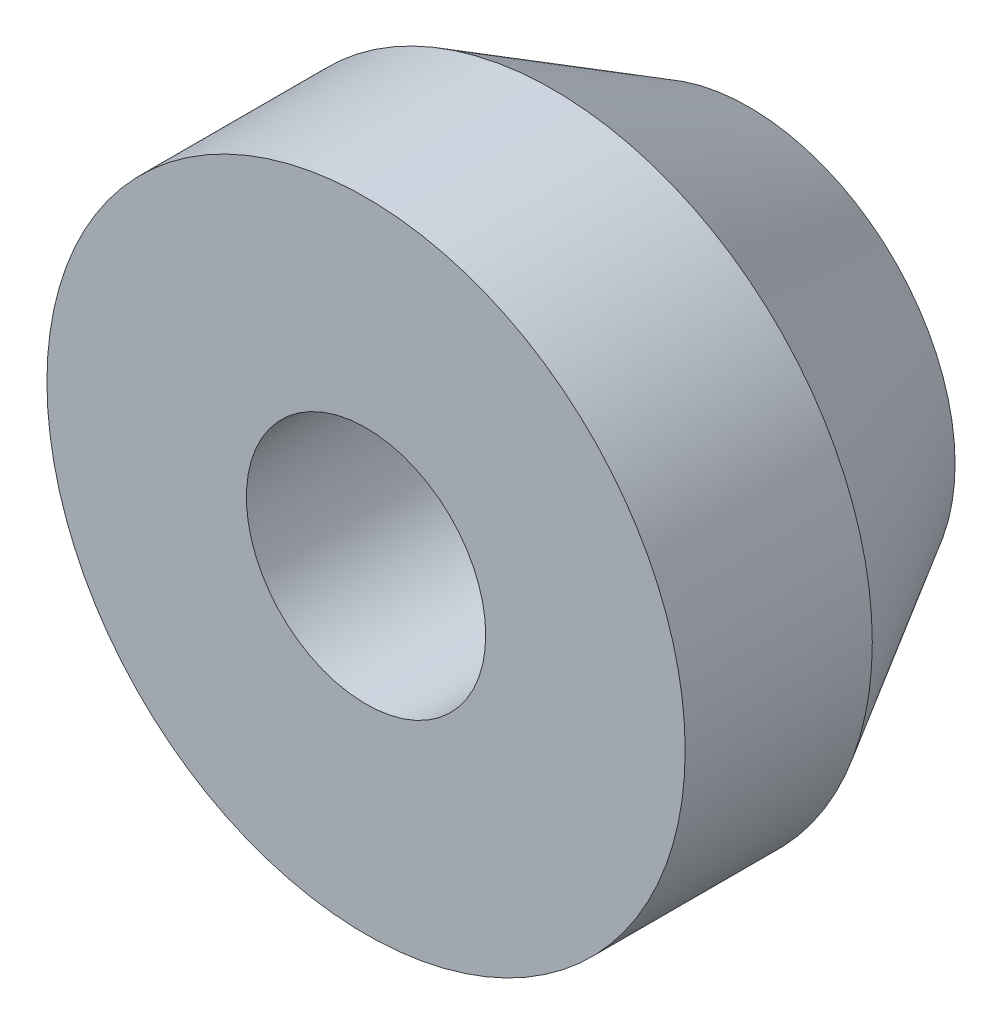
ISO-10303-21;
HEADER;
FILE_DESCRIPTION(('STEP AP214'),'2;1');
FILE_NAME('part.step','',(''),(''),'','','');
FILE_SCHEMA(('AUTOMOTIVE_DESIGN { 1 0 10303 214 1 1 1 1 }'));
ENDSEC;
DATA;
#1=APPLICATION_CONTEXT('core data for automotive mechanical design processes');
#2=APPLICATION_PROTOCOL_DEFINITION('international standard','automotive_design',2000,#1);
#3=PRODUCT_CONTEXT('',#1,'mechanical');
#4=PRODUCT('Part','Part','',(#3));
#5=PRODUCT_RELATED_PRODUCT_CATEGORY('part','',(#4));
#6=PRODUCT_DEFINITION_FORMATION('','',#4);
#7=PRODUCT_DEFINITION_CONTEXT('part definition',#1,'design');
#8=PRODUCT_DEFINITION('design','',#6,#7);
#9=PRODUCT_DEFINITION_SHAPE('','',#8);
#10=(LENGTH_UNIT() NAMED_UNIT(*) SI_UNIT(.MILLI.,.METRE.));
#11=(NAMED_UNIT(*) PLANE_ANGLE_UNIT() SI_UNIT($,.RADIAN.));
#12=(NAMED_UNIT(*) SI_UNIT($,.STERADIAN.) SOLID_ANGLE_UNIT());
#13=UNCERTAINTY_MEASURE_WITH_UNIT(LENGTH_MEASURE(1.E-05),#10,'distance_accuracy_value','');
#14=(GEOMETRIC_REPRESENTATION_CONTEXT(3) GLOBAL_UNCERTAINTY_ASSIGNED_CONTEXT((#13)) GLOBAL_UNIT_ASSIGNED_CONTEXT((#10,
#11,#12)) REPRESENTATION_CONTEXT('',''));
#15=CARTESIAN_POINT('',(0.,0.,0.));
#16=DIRECTION('',(0.,0.,1.));
#17=DIRECTION('',(1.,0.,0.));
#18=AXIS2_PLACEMENT_3D('',#15,#16,#17);
#19=CARTESIAN_POINT('',(-12.7,0.,-15.24));
#20=DIRECTION('',(0.,0.,1.));
#21=DIRECTION('',(1.,0.,0.));
#22=AXIS2_PLACEMENT_3D('',#19,#20,#21);
#23=PLANE('',#22);
#24=CARTESIAN_POINT('',(0.,0.,-15.24));
#25=DIRECTION('',(0.,0.,1.));
#26=DIRECTION('',(1.,0.,0.));
#27=AXIS2_PLACEMENT_3D('',#24,#25,#26);
#28=CIRCLE('',#27,8.19999999999999);
#29=CARTESIAN_POINT('',(8.19999999999999,0.,-15.24));
#30=VERTEX_POINT('',#29);
#31=EDGE_CURVE('E10',#30,#30,#28,.F.);
#32=ORIENTED_EDGE('',*,*,#31,.T.);
#33=EDGE_LOOP('',(#32));
#34=FACE_BOUND('',#33,.T.);
#35=CARTESIAN_POINT('',(0.,0.,-15.24));
#36=DIRECTION('',(0.,0.,1.));
#37=DIRECTION('',(1.,0.,0.));
#38=AXIS2_PLACEMENT_3D('',#35,#36,#37);
#39=CIRCLE('',#38,4.7625);
#40=CARTESIAN_POINT('',(4.7625,0.,-15.24));
#41=VERTEX_POINT('',#40);
#42=EDGE_CURVE('E52',#41,#41,#39,.T.);
#43=ORIENTED_EDGE('',*,*,#42,.T.);
#44=EDGE_LOOP('',(#43));
#45=FACE_BOUND('',#44,.T.);
#46=ADVANCED_FACE('F38',(#34,#45),#23,.F.);
#47=CARTESIAN_POINT('',(0.,0.,0.));
#48=DIRECTION('',(0.,0.,1.));
#49=DIRECTION('',(1.,0.,0.));
#50=AXIS2_PLACEMENT_3D('',#47,#48,#49);
#51=CYLINDRICAL_SURFACE('',#50,4.7625);
#52=ORIENTED_EDGE('',*,*,#42,.F.);
#53=EDGE_LOOP('',(#52));
#54=FACE_BOUND('',#53,.T.);
#55=CARTESIAN_POINT('',(0.,0.,0.));
#56=DIRECTION('',(0.,0.,1.));
#57=DIRECTION('',(1.,0.,0.));
#58=AXIS2_PLACEMENT_3D('',#55,#56,#57);
#59=CIRCLE('',#58,4.7625);
#60=CARTESIAN_POINT('',(4.7625,0.,0.));
#61=VERTEX_POINT('',#60);
#62=EDGE_CURVE('E57',#61,#61,#59,.T.);
#63=ORIENTED_EDGE('',*,*,#62,.T.);
#64=EDGE_LOOP('',(#63));
#65=FACE_BOUND('',#64,.T.);
#66=ADVANCED_FACE('F80',(#54,#65),#51,.F.);
#67=CARTESIAN_POINT('',(-12.7,0.,0.));
#68=DIRECTION('',(0.,0.,-1.));
#69=DIRECTION('',(-1.,0.,0.));
#70=AXIS2_PLACEMENT_3D('',#67,#68,#69);
#71=PLANE('',#70);
#72=ORIENTED_EDGE('',*,*,#62,.F.);
#73=EDGE_LOOP('',(#72));
#74=FACE_BOUND('',#73,.T.);
#75=CARTESIAN_POINT('',(0.,0.,0.));
#76=DIRECTION('',(0.,0.,1.));
#77=DIRECTION('',(1.,0.,0.));
#78=AXIS2_PLACEMENT_3D('',#75,#76,#77);
#79=CIRCLE('',#78,12.7);
#80=CARTESIAN_POINT('',(12.7,0.,0.));
#81=VERTEX_POINT('',#80);
#82=EDGE_CURVE('E63',#81,#81,#79,.T.);
#83=ORIENTED_EDGE('',*,*,#82,.T.);
#84=EDGE_LOOP('',(#83));
#85=FACE_BOUND('',#84,.T.);
#86=ADVANCED_FACE('F68',(#74,#85),#71,.F.);
#87=CARTESIAN_POINT('',(0.,0.,0.));
#88=DIRECTION('',(0.,0.,1.));
#89=DIRECTION('',(1.,0.,0.));
#90=AXIS2_PLACEMENT_3D('',#87,#88,#89);
#91=CYLINDRICAL_SURFACE('',#90,12.7);
#92=CARTESIAN_POINT('',(0.,0.,-7.44577136594005));
#93=DIRECTION('',(0.,0.,1.));
#94=DIRECTION('',(1.,0.,0.));
#95=AXIS2_PLACEMENT_3D('',#92,#93,#94);
#96=CIRCLE('',#95,12.7);
#97=CARTESIAN_POINT('',(12.7,0.,-7.44577136594005));
#98=VERTEX_POINT('',#97);
#99=EDGE_CURVE('E47',#98,#98,#96,.T.);
#100=ORIENTED_EDGE('',*,*,#99,.T.);
#101=EDGE_LOOP('',(#100));
#102=FACE_BOUND('',#101,.T.);
#103=ORIENTED_EDGE('',*,*,#82,.F.);
#104=EDGE_LOOP('',(#103));
#105=FACE_BOUND('',#104,.T.);
#106=ADVANCED_FACE('F70',(#102,#105),#91,.T.);
#107=CARTESIAN_POINT('',(0.,0.,-7.44577136594005));
#108=DIRECTION('',(0.,0.,1.));
#109=DIRECTION('',(1.,0.,0.));
#110=AXIS2_PLACEMENT_3D('',#107,#108,#109);
#111=CONICAL_SURFACE('',#110,12.7,0.5235987755983);
#112=CARTESIAN_POINT('',(8.19999999999999,0.,-15.24));
#113=CARTESIAN_POINT('',(8.24687499999999,0.,-15.1588101183952));
#114=CARTESIAN_POINT('',(8.29374999999999,0.,-15.0776202367904));
#115=CARTESIAN_POINT('',(8.38749999999999,0.,-14.9152404735808));
#116=CARTESIAN_POINT('',(8.43437499999999,0.,-14.834050591976));
#117=CARTESIAN_POINT('',(8.52812499999999,0.,-14.6716708287665));
#118=CARTESIAN_POINT('',(8.57499999999999,0.,-14.5904809471617));
#119=CARTESIAN_POINT('',(8.66874999999999,0.,-14.4281011839521));
#120=CARTESIAN_POINT('',(8.71562499999999,0.,-14.3469113023473));
#121=CARTESIAN_POINT('',(8.80937499999999,0.,-14.1845315391377));
#122=CARTESIAN_POINT('',(8.85624999999999,0.,-14.1033416575329));
#123=CARTESIAN_POINT('',(8.94999999999999,0.,-13.9409618943233));
#124=CARTESIAN_POINT('',(8.99687499999999,0.,-13.8597720127186));
#125=CARTESIAN_POINT('',(9.09062499999999,0.,-13.697392249509));
#126=CARTESIAN_POINT('',(9.13749999999999,0.,-13.6162023679042));
#127=CARTESIAN_POINT('',(9.23124999999999,0.,-13.4538226046946));
#128=CARTESIAN_POINT('',(9.27812499999999,0.,-13.3726327230898));
#129=CARTESIAN_POINT('',(9.37187499999999,0.,-13.2102529598802));
#130=CARTESIAN_POINT('',(9.41874999999999,0.,-13.1290630782754));
#131=CARTESIAN_POINT('',(9.51249999999999,0.,-12.9666833150658));
#132=CARTESIAN_POINT('',(9.55937499999999,0.,-12.8854934334611));
#133=CARTESIAN_POINT('',(9.65312499999999,0.,-12.7231136702515));
#134=CARTESIAN_POINT('',(9.69999999999999,0.,-12.6419237886467));
#135=CARTESIAN_POINT('',(9.79374999999999,0.,-12.4795440254371));
#136=CARTESIAN_POINT('',(9.84062499999999,0.,-12.3983541438323));
#137=CARTESIAN_POINT('',(9.93437499999999,0.,-12.2359743806227));
#138=CARTESIAN_POINT('',(9.98124999999999,0.,-12.1547844990179));
#139=CARTESIAN_POINT('',(10.075,0.,-11.9924047358084));
#140=CARTESIAN_POINT('',(10.121875,0.,-11.9112148542036));
#141=CARTESIAN_POINT('',(10.215625,0.,-11.748835090994));
#142=CARTESIAN_POINT('',(10.2625,0.,-11.6676452093892));
#143=CARTESIAN_POINT('',(10.35625,0.,-11.5052654461796));
#144=CARTESIAN_POINT('',(10.403125,0.,-11.4240755645748));
#145=CARTESIAN_POINT('',(10.496875,0.,-11.2616958013652));
#146=CARTESIAN_POINT('',(10.54375,0.,-11.1805059197604));
#147=CARTESIAN_POINT('',(10.6375,0.,-11.0181261565509));
#148=CARTESIAN_POINT('',(10.684375,0.,-10.9369362749461));
#149=CARTESIAN_POINT('',(10.778125,0.,-10.7745565117365));
#150=CARTESIAN_POINT('',(10.825,0.,-10.6933666301317));
#151=CARTESIAN_POINT('',(10.91875,0.,-10.5309868669221));
#152=CARTESIAN_POINT('',(10.965625,0.,-10.4497969853173));
#153=CARTESIAN_POINT('',(11.059375,0.,-10.2874172221077));
#154=CARTESIAN_POINT('',(11.10625,0.,-10.206227340503));
#155=CARTESIAN_POINT('',(11.2,0.,-10.0438475772934));
#156=CARTESIAN_POINT('',(11.246875,0.,-9.96265769568858));
#157=CARTESIAN_POINT('',(11.340625,0.,-9.800277932479));
#158=CARTESIAN_POINT('',(11.3875,0.,-9.71908805087421));
#159=CARTESIAN_POINT('',(11.48125,0.,-9.55670828766462));
#160=CARTESIAN_POINT('',(11.528125,0.,-9.47551840605983));
#161=CARTESIAN_POINT('',(11.621875,0.,-9.31313864285025));
#162=CARTESIAN_POINT('',(11.66875,0.,-9.23194876124546));
#163=CARTESIAN_POINT('',(11.7625,0.,-9.06956899803588));
#164=CARTESIAN_POINT('',(11.809375,0.,-8.98837911643109));
#165=CARTESIAN_POINT('',(11.903125,0.,-8.8259993532215));
#166=CARTESIAN_POINT('',(11.95,0.,-8.74480947161671));
#167=CARTESIAN_POINT('',(12.04375,0.,-8.58242970840713));
#168=CARTESIAN_POINT('',(12.090625,0.,-8.50123982680234));
#169=CARTESIAN_POINT('',(12.184375,0.,-8.33886006359276));
#170=CARTESIAN_POINT('',(12.23125,0.,-8.25767018198797));
#171=CARTESIAN_POINT('',(12.325,0.,-8.09529041877838));
#172=CARTESIAN_POINT('',(12.371875,0.,-8.01410053717359));
#173=CARTESIAN_POINT('',(12.465625,0.,-7.85172077396401));
#174=CARTESIAN_POINT('',(12.5125,0.,-7.77053089235922));
#175=CARTESIAN_POINT('',(12.60625,0.,-7.60815112914964));
#176=CARTESIAN_POINT('',(12.653125,0.,-7.52696124754485));
#177=CARTESIAN_POINT('',(12.7,0.,-7.44577136594005));
#178=B_SPLINE_CURVE_WITH_KNOTS('',3,(#112,#113,#114,#115,#116,#117,#118,#119,#120,#121,#122,
#123,#124,#125,#126,#127,#128,#129,#130,#131,#132,#133,#134,#135,#136,#137,#138,#139,#140,#141,
#142,#143,#144,#145,#146,#147,#148,#149,#150,#151,#152,#153,#154,#155,#156,#157,#158,#159,#160,
#161,#162,#163,#164,#165,#166,#167,#168,#169,#170,#171,#172,#173,#174,#175,#176,#177),
.UNSPECIFIED.,.F.,.F.,(4,2,2,2,2,2,2,2,2,2,2,2,2,2,2,2,2,2,2,2,2,2,2,2,2,2,2,2,2,2,2,2,4),(0.,
0.28125,0.562500000000001,0.84375,1.125,1.40625,1.6875,1.96875,2.25,2.53125,2.8125,3.09375,
3.375,3.65625,3.9375,4.21875,4.5,4.78125,5.0625,5.34375,5.625,5.90625,6.1875,6.46875,6.75,
7.03125,7.3125,7.59375,7.875,8.15625,8.4375,8.71875,9.),.UNSPECIFIED.);
#179=EDGE_CURVE('BSEAM41',#30,#98,#178,.T.);
#180=ORIENTED_EDGE('',*,*,#31,.F.);
#181=ORIENTED_EDGE('',*,*,#99,.F.);
#182=ORIENTED_EDGE('',*,*,#179,.T.);
#183=ORIENTED_EDGE('',*,*,#179,.F.);
#184=EDGE_LOOP('',(#180,#182,#181,#183));
#185=FACE_BOUND('',#184,.T.);
#186=ADVANCED_FACE('F41',(#185),#111,.T.);
#187=CLOSED_SHELL('',(#46,#66,#86,#106,#186));
#188=MANIFOLD_SOLID_BREP('B2',#187);
#189=ADVANCED_BREP_SHAPE_REPRESENTATION('',(#18,#188),#14);
#190=SHAPE_DEFINITION_REPRESENTATION(#9,#189);
ENDSEC;
END-ISO-10303-21;
